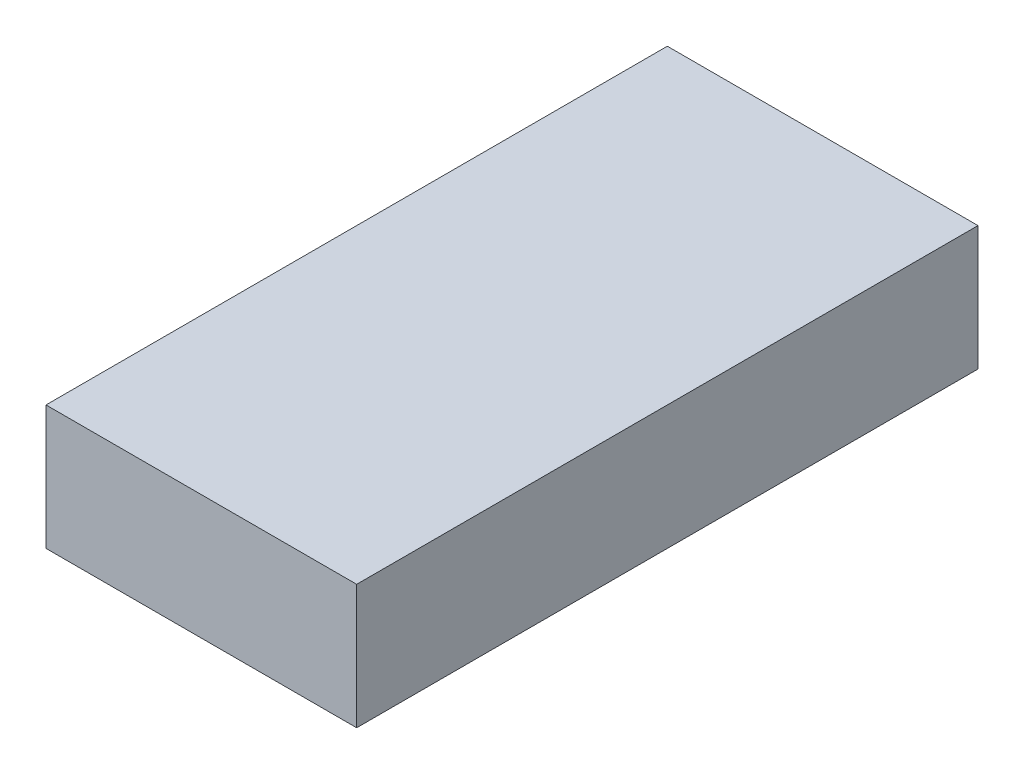
ISO-10303-21;
HEADER;
FILE_DESCRIPTION(('STEP AP214'),'2;1');
FILE_NAME('part.step','',(''),(''),'','','');
FILE_SCHEMA(('AUTOMOTIVE_DESIGN { 1 0 10303 214 1 1 1 1 }'));
ENDSEC;
DATA;
#1=APPLICATION_CONTEXT('core data for automotive mechanical design processes');
#2=APPLICATION_PROTOCOL_DEFINITION('international standard','automotive_design',2000,#1);
#3=PRODUCT_CONTEXT('',#1,'mechanical');
#4=PRODUCT('Part','Part','',(#3));
#5=PRODUCT_RELATED_PRODUCT_CATEGORY('part','',(#4));
#6=PRODUCT_DEFINITION_FORMATION('','',#4);
#7=PRODUCT_DEFINITION_CONTEXT('part definition',#1,'design');
#8=PRODUCT_DEFINITION('design','',#6,#7);
#9=PRODUCT_DEFINITION_SHAPE('','',#8);
#10=(LENGTH_UNIT() NAMED_UNIT(*) SI_UNIT(.MILLI.,.METRE.));
#11=(NAMED_UNIT(*) PLANE_ANGLE_UNIT() SI_UNIT($,.RADIAN.));
#12=(NAMED_UNIT(*) SI_UNIT($,.STERADIAN.) SOLID_ANGLE_UNIT());
#13=UNCERTAINTY_MEASURE_WITH_UNIT(LENGTH_MEASURE(1.E-05),#10,'distance_accuracy_value','');
#14=(GEOMETRIC_REPRESENTATION_CONTEXT(3) GLOBAL_UNCERTAINTY_ASSIGNED_CONTEXT((#13)) GLOBAL_UNIT_ASSIGNED_CONTEXT((#10,
#11,#12)) REPRESENTATION_CONTEXT('',''));
#15=CARTESIAN_POINT('',(0.,0.,0.));
#16=DIRECTION('',(0.,0.,1.));
#17=DIRECTION('',(1.,0.,0.));
#18=AXIS2_PLACEMENT_3D('',#15,#16,#17);
#19=CARTESIAN_POINT('',(-12.5,10.,25.));
#20=DIRECTION('',(1.,0.,0.));
#21=DIRECTION('',(0.,0.,-1.));
#22=AXIS2_PLACEMENT_3D('',#19,#20,#21);
#23=PLANE('',#22);
#24=DIRECTION('',(0.,0.,1.));
#25=VECTOR('',#24,1.);
#26=CARTESIAN_POINT('',(-12.5,0.,25.));
#27=LINE('',#26,#25);
#28=CARTESIAN_POINT('',(-12.5,0.,-25.));
#29=VERTEX_POINT('',#28);
#30=CARTESIAN_POINT('',(-12.5,0.,25.));
#31=VERTEX_POINT('',#30);
#32=EDGE_CURVE('E98',#29,#31,#27,.T.);
#33=ORIENTED_EDGE('',*,*,#32,.T.);
#34=DIRECTION('',(0.,-1.,0.));
#35=VECTOR('',#34,1.);
#36=CARTESIAN_POINT('',(-12.5,10.,25.));
#37=LINE('',#36,#35);
#38=CARTESIAN_POINT('',(-12.5,10.,25.));
#39=VERTEX_POINT('',#38);
#40=EDGE_CURVE('E11',#39,#31,#37,.T.);
#41=ORIENTED_EDGE('',*,*,#40,.F.);
#42=DIRECTION('',(0.,0.,1.));
#43=VECTOR('',#42,1.);
#44=CARTESIAN_POINT('',(-12.5,10.,25.));
#45=LINE('',#44,#43);
#46=CARTESIAN_POINT('',(-12.5,10.,-25.));
#47=VERTEX_POINT('',#46);
#48=EDGE_CURVE('E86',#47,#39,#45,.T.);
#49=ORIENTED_EDGE('',*,*,#48,.F.);
#50=DIRECTION('',(0.,-1.,0.));
#51=VECTOR('',#50,1.);
#52=CARTESIAN_POINT('',(-12.5,10.,-25.));
#53=LINE('',#52,#51);
#54=EDGE_CURVE('E94',#47,#29,#53,.T.);
#55=ORIENTED_EDGE('',*,*,#54,.T.);
#56=EDGE_LOOP('',(#33,#41,#49,#55));
#57=FACE_BOUND('',#56,.T.);
#58=ADVANCED_FACE('F35',(#57),#23,.F.);
#59=CARTESIAN_POINT('',(12.5,10.,25.));
#60=DIRECTION('',(0.,0.,-1.));
#61=DIRECTION('',(-1.,0.,0.));
#62=AXIS2_PLACEMENT_3D('',#59,#60,#61);
#63=PLANE('',#62);
#64=DIRECTION('',(1.,0.,0.));
#65=VECTOR('',#64,1.);
#66=CARTESIAN_POINT('',(12.5,0.,25.));
#67=LINE('',#66,#65);
#68=CARTESIAN_POINT('',(12.5,0.,25.));
#69=VERTEX_POINT('',#68);
#70=EDGE_CURVE('E90',#31,#69,#67,.T.);
#71=ORIENTED_EDGE('',*,*,#70,.T.);
#72=DIRECTION('',(0.,-1.,0.));
#73=VECTOR('',#72,1.);
#74=CARTESIAN_POINT('',(12.5,10.,25.));
#75=LINE('',#74,#73);
#76=CARTESIAN_POINT('',(12.5,10.,25.));
#77=VERTEX_POINT('',#76);
#78=EDGE_CURVE('E43',#77,#69,#75,.T.);
#79=ORIENTED_EDGE('',*,*,#78,.F.);
#80=DIRECTION('',(1.,0.,0.));
#81=VECTOR('',#80,1.);
#82=CARTESIAN_POINT('',(12.5,10.,25.));
#83=LINE('',#82,#81);
#84=EDGE_CURVE('E81',#39,#77,#83,.T.);
#85=ORIENTED_EDGE('',*,*,#84,.F.);
#86=ORIENTED_EDGE('',*,*,#40,.T.);
#87=EDGE_LOOP('',(#71,#79,#85,#86));
#88=FACE_BOUND('',#87,.T.);
#89=ADVANCED_FACE('F89',(#88),#63,.F.);
#90=CARTESIAN_POINT('',(12.5,10.,25.));
#91=DIRECTION('',(-1.,0.,0.));
#92=DIRECTION('',(0.,0.,1.));
#93=AXIS2_PLACEMENT_3D('',#90,#91,#92);
#94=PLANE('',#93);
#95=DIRECTION('',(0.,0.,-1.));
#96=VECTOR('',#95,1.);
#97=CARTESIAN_POINT('',(12.5,0.,25.));
#98=LINE('',#97,#96);
#99=CARTESIAN_POINT('',(12.5,0.,-25.));
#100=VERTEX_POINT('',#99);
#101=EDGE_CURVE('E68',#69,#100,#98,.T.);
#102=ORIENTED_EDGE('',*,*,#101,.T.);
#103=DIRECTION('',(0.,-1.,0.));
#104=VECTOR('',#103,1.);
#105=CARTESIAN_POINT('',(12.5,10.,-25.));
#106=LINE('',#105,#104);
#107=CARTESIAN_POINT('',(12.5,10.,-25.));
#108=VERTEX_POINT('',#107);
#109=EDGE_CURVE('E91',#108,#100,#106,.T.);
#110=ORIENTED_EDGE('',*,*,#109,.F.);
#111=DIRECTION('',(0.,0.,-1.));
#112=VECTOR('',#111,1.);
#113=CARTESIAN_POINT('',(12.5,10.,25.));
#114=LINE('',#113,#112);
#115=EDGE_CURVE('E84',#77,#108,#114,.T.);
#116=ORIENTED_EDGE('',*,*,#115,.F.);
#117=ORIENTED_EDGE('',*,*,#78,.T.);
#118=EDGE_LOOP('',(#102,#110,#116,#117));
#119=FACE_BOUND('',#118,.T.);
#120=ADVANCED_FACE('F92',(#119),#94,.F.);
#121=CARTESIAN_POINT('',(12.5,10.,-25.));
#122=DIRECTION('',(0.,0.,1.));
#123=DIRECTION('',(1.,0.,0.));
#124=AXIS2_PLACEMENT_3D('',#121,#122,#123);
#125=PLANE('',#124);
#126=DIRECTION('',(-1.,0.,0.));
#127=VECTOR('',#126,1.);
#128=CARTESIAN_POINT('',(12.5,0.,-25.));
#129=LINE('',#128,#127);
#130=EDGE_CURVE('E74',#100,#29,#129,.T.);
#131=ORIENTED_EDGE('',*,*,#130,.T.);
#132=ORIENTED_EDGE('',*,*,#54,.F.);
#133=DIRECTION('',(-1.,0.,0.));
#134=VECTOR('',#133,1.);
#135=CARTESIAN_POINT('',(12.5,10.,-25.));
#136=LINE('',#135,#134);
#137=EDGE_CURVE('E51',#108,#47,#136,.T.);
#138=ORIENTED_EDGE('',*,*,#137,.F.);
#139=ORIENTED_EDGE('',*,*,#109,.T.);
#140=EDGE_LOOP('',(#131,#132,#138,#139));
#141=FACE_BOUND('',#140,.T.);
#142=ADVANCED_FACE('F105',(#141),#125,.F.);
#143=CARTESIAN_POINT('',(0.,10.,0.));
#144=DIRECTION('',(0.,1.,0.));
#145=DIRECTION('',(0.,0.,1.));
#146=AXIS2_PLACEMENT_3D('',#143,#144,#145);
#147=PLANE('',#146);
#148=ORIENTED_EDGE('',*,*,#48,.T.);
#149=ORIENTED_EDGE('',*,*,#84,.T.);
#150=ORIENTED_EDGE('',*,*,#115,.T.);
#151=ORIENTED_EDGE('',*,*,#137,.T.);
#152=EDGE_LOOP('',(#148,#149,#150,#151));
#153=FACE_BOUND('',#152,.T.);
#154=ADVANCED_FACE('F82',(#153),#147,.T.);
#155=CARTESIAN_POINT('',(0.,0.,0.));
#156=DIRECTION('',(0.,1.,0.));
#157=DIRECTION('',(0.,0.,1.));
#158=AXIS2_PLACEMENT_3D('',#155,#156,#157);
#159=PLANE('',#158);
#160=ORIENTED_EDGE('',*,*,#32,.F.);
#161=ORIENTED_EDGE('',*,*,#130,.F.);
#162=ORIENTED_EDGE('',*,*,#101,.F.);
#163=ORIENTED_EDGE('',*,*,#70,.F.);
#164=EDGE_LOOP('',(#160,#161,#162,#163));
#165=FACE_BOUND('',#164,.T.);
#166=ADVANCED_FACE('F108',(#165),#159,.F.);
#167=CLOSED_SHELL('',(#58,#89,#120,#142,#154,#166));
#168=MANIFOLD_SOLID_BREP('B2',#167);
#169=ADVANCED_BREP_SHAPE_REPRESENTATION('',(#18,#168),#14);
#170=SHAPE_DEFINITION_REPRESENTATION(#9,#169);
ENDSEC;
END-ISO-10303-21;
